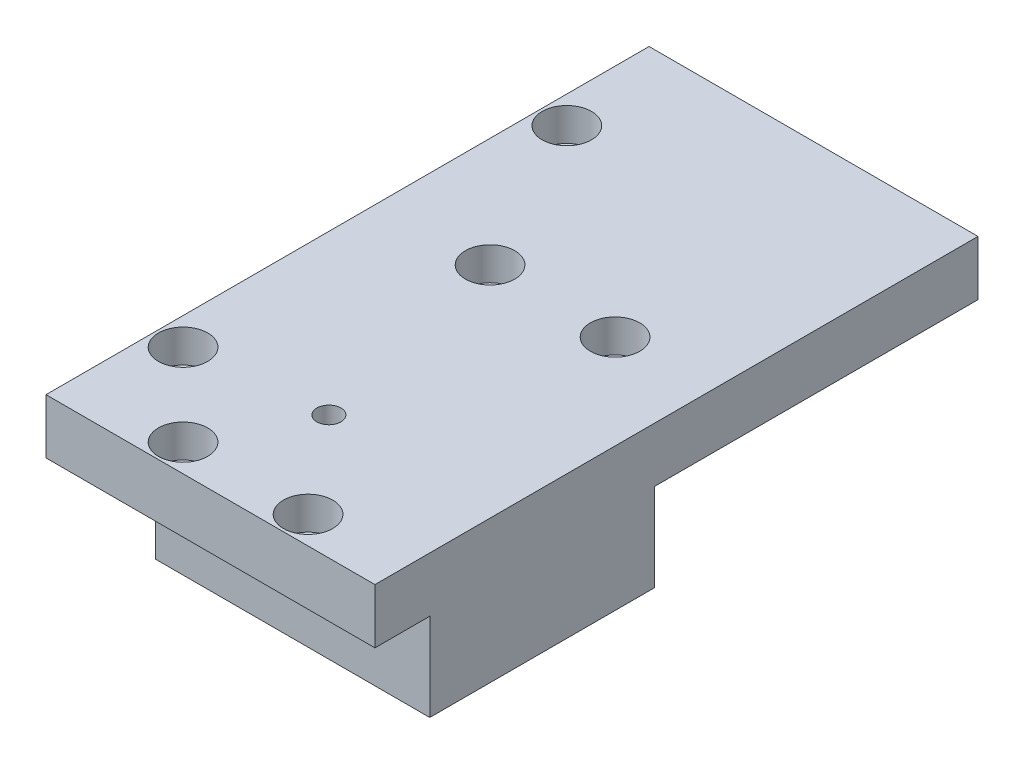
ISO-10303-21;
HEADER;
FILE_DESCRIPTION(('STEP AP214'),'2;1');
FILE_NAME('part.step','',(''),(''),'','','');
FILE_SCHEMA(('AUTOMOTIVE_DESIGN { 1 0 10303 214 1 1 1 1 }'));
ENDSEC;
DATA;
#1=APPLICATION_CONTEXT('core data for automotive mechanical design processes');
#2=APPLICATION_PROTOCOL_DEFINITION('international standard','automotive_design',2000,#1);
#3=PRODUCT_CONTEXT('',#1,'mechanical');
#4=PRODUCT('Part','Part','',(#3));
#5=PRODUCT_RELATED_PRODUCT_CATEGORY('part','',(#4));
#6=PRODUCT_DEFINITION_FORMATION('','',#4);
#7=PRODUCT_DEFINITION_CONTEXT('part definition',#1,'design');
#8=PRODUCT_DEFINITION('design','',#6,#7);
#9=PRODUCT_DEFINITION_SHAPE('','',#8);
#10=(LENGTH_UNIT() NAMED_UNIT(*) SI_UNIT(.MILLI.,.METRE.));
#11=(NAMED_UNIT(*) PLANE_ANGLE_UNIT() SI_UNIT($,.RADIAN.));
#12=(NAMED_UNIT(*) SI_UNIT($,.STERADIAN.) SOLID_ANGLE_UNIT());
#13=UNCERTAINTY_MEASURE_WITH_UNIT(LENGTH_MEASURE(1.E-05),#10,'distance_accuracy_value','');
#14=(GEOMETRIC_REPRESENTATION_CONTEXT(3) GLOBAL_UNCERTAINTY_ASSIGNED_CONTEXT((#13)) GLOBAL_UNIT_ASSIGNED_CONTEXT((#10,
#11,#12)) REPRESENTATION_CONTEXT('',''));
#15=CARTESIAN_POINT('',(0.,0.,0.));
#16=DIRECTION('',(0.,0.,1.));
#17=DIRECTION('',(1.,0.,0.));
#18=AXIS2_PLACEMENT_3D('',#15,#16,#17);
#19=CARTESIAN_POINT('',(0.,0.,0.));
#20=DIRECTION('',(0.,1.,0.));
#21=DIRECTION('',(0.,0.,1.));
#22=AXIS2_PLACEMENT_3D('',#19,#20,#21);
#23=PLANE('',#22);
#24=CARTESIAN_POINT('',(-20.,0.,24.5));
#25=DIRECTION('',(0.,1.,0.));
#26=DIRECTION('',(0.,0.,1.));
#27=AXIS2_PLACEMENT_3D('',#24,#25,#26);
#28=CIRCLE('',#27,1.5);
#29=CARTESIAN_POINT('',(-20.,0.,26.));
#30=VERTEX_POINT('',#29);
#31=EDGE_CURVE('E176',#30,#30,#28,.T.);
#32=ORIENTED_EDGE('',*,*,#31,.T.);
#33=EDGE_LOOP('',(#32));
#34=FACE_BOUND('',#33,.T.);
#35=CARTESIAN_POINT('',(-8.60000000000001,0.,52.5));
#36=DIRECTION('',(0.,1.,0.));
#37=DIRECTION('',(0.,0.,1.));
#38=AXIS2_PLACEMENT_3D('',#35,#36,#37);
#39=CIRCLE('',#38,1.5);
#40=CARTESIAN_POINT('',(-8.60000000000001,0.,54.));
#41=VERTEX_POINT('',#40);
#42=EDGE_CURVE('E177',#41,#41,#39,.T.);
#43=ORIENTED_EDGE('',*,*,#42,.T.);
#44=EDGE_LOOP('',(#43));
#45=FACE_BOUND('',#44,.T.);
#46=CARTESIAN_POINT('',(-20.,0.,52.5));
#47=DIRECTION('',(0.,1.,0.));
#48=DIRECTION('',(0.,0.,1.));
#49=AXIS2_PLACEMENT_3D('',#46,#47,#48);
#50=CIRCLE('',#49,1.5);
#51=CARTESIAN_POINT('',(-20.,0.,54.));
#52=VERTEX_POINT('',#51);
#53=EDGE_CURVE('E180',#52,#52,#50,.T.);
#54=ORIENTED_EDGE('',*,*,#53,.T.);
#55=EDGE_LOOP('',(#54));
#56=FACE_BOUND('',#55,.T.);
#57=CARTESIAN_POINT('',(-27.5,0.,45.));
#58=DIRECTION('',(0.,1.,0.));
#59=DIRECTION('',(0.,0.,1.));
#60=AXIS2_PLACEMENT_3D('',#57,#58,#59);
#61=CIRCLE('',#60,1.5);
#62=CARTESIAN_POINT('',(-27.5,0.,46.5));
#63=VERTEX_POINT('',#62);
#64=EDGE_CURVE('E172',#63,#63,#61,.T.);
#65=ORIENTED_EDGE('',*,*,#64,.T.);
#66=EDGE_LOOP('',(#65));
#67=FACE_BOUND('',#66,.T.);
#68=CARTESIAN_POINT('',(-8.60000000000001,0.,24.5));
#69=DIRECTION('',(0.,1.,0.));
#70=DIRECTION('',(0.,0.,1.));
#71=AXIS2_PLACEMENT_3D('',#68,#69,#70);
#72=CIRCLE('',#71,1.5);
#73=CARTESIAN_POINT('',(-8.60000000000001,0.,26.));
#74=VERTEX_POINT('',#73);
#75=EDGE_CURVE('E173',#74,#74,#72,.T.);
#76=ORIENTED_EDGE('',*,*,#75,.T.);
#77=EDGE_LOOP('',(#76));
#78=FACE_BOUND('',#77,.T.);
#79=CARTESIAN_POINT('',(-27.5,0.,9.99999999999999));
#80=DIRECTION('',(0.,1.,0.));
#81=DIRECTION('',(0.,0.,1.));
#82=AXIS2_PLACEMENT_3D('',#79,#80,#81);
#83=CIRCLE('',#82,1.5);
#84=CARTESIAN_POINT('',(-27.5,0.,11.5));
#85=VERTEX_POINT('',#84);
#86=EDGE_CURVE('E168',#85,#85,#83,.T.);
#87=ORIENTED_EDGE('',*,*,#86,.T.);
#88=EDGE_LOOP('',(#87));
#89=FACE_BOUND('',#88,.T.);
#90=DIRECTION('',(1.,0.,0.));
#91=VECTOR('',#90,1.);
#92=CARTESIAN_POINT('',(0.,0.,29.5));
#93=LINE('',#92,#91);
#94=CARTESIAN_POINT('',(-25.,0.,29.5));
#95=VERTEX_POINT('',#94);
#96=CARTESIAN_POINT('',(0.,0.,29.5));
#97=VERTEX_POINT('',#96);
#98=EDGE_CURVE('E54',#95,#97,#93,.T.);
#99=ORIENTED_EDGE('',*,*,#98,.F.);
#100=DIRECTION('',(0.,0.,-1.));
#101=VECTOR('',#100,1.);
#102=CARTESIAN_POINT('',(-25.,0.,50.));
#103=LINE('',#102,#101);
#104=CARTESIAN_POINT('',(-25.,0.,50.));
#105=VERTEX_POINT('',#104);
#106=EDGE_CURVE('E294',#105,#95,#103,.T.);
#107=ORIENTED_EDGE('',*,*,#106,.F.);
#108=DIRECTION('',(-1.,0.,0.));
#109=VECTOR('',#108,1.);
#110=CARTESIAN_POINT('',(0.,0.,50.));
#111=LINE('',#110,#109);
#112=CARTESIAN_POINT('',(0.,0.,50.));
#113=VERTEX_POINT('',#112);
#114=EDGE_CURVE('E296',#113,#105,#111,.T.);
#115=ORIENTED_EDGE('',*,*,#114,.F.);
#116=DIRECTION('',(0.,0.,-1.));
#117=VECTOR('',#116,1.);
#118=CARTESIAN_POINT('',(0.,0.,55.));
#119=LINE('',#118,#117);
#120=CARTESIAN_POINT('',(0.,0.,55.));
#121=VERTEX_POINT('',#120);
#122=EDGE_CURVE('E125',#121,#113,#119,.T.);
#123=ORIENTED_EDGE('',*,*,#122,.F.);
#124=DIRECTION('',(1.,0.,0.));
#125=VECTOR('',#124,1.);
#126=CARTESIAN_POINT('',(-30.,0.,55.));
#127=LINE('',#126,#125);
#128=CARTESIAN_POINT('',(-30.,0.,55.));
#129=VERTEX_POINT('',#128);
#130=EDGE_CURVE('E171',#129,#121,#127,.T.);
#131=ORIENTED_EDGE('',*,*,#130,.F.);
#132=DIRECTION('',(0.,0.,-1.));
#133=VECTOR('',#132,1.);
#134=CARTESIAN_POINT('',(-30.,0.,55.));
#135=LINE('',#134,#133);
#136=CARTESIAN_POINT('',(-30.,0.,0.));
#137=VERTEX_POINT('',#136);
#138=EDGE_CURVE('E191',#129,#137,#135,.T.);
#139=ORIENTED_EDGE('',*,*,#138,.T.);
#140=DIRECTION('',(1.,0.,0.));
#141=VECTOR('',#140,1.);
#142=CARTESIAN_POINT('',(-30.,0.,0.));
#143=LINE('',#142,#141);
#144=CARTESIAN_POINT('',(0.,0.,0.));
#145=VERTEX_POINT('',#144);
#146=EDGE_CURVE('E203',#137,#145,#143,.T.);
#147=ORIENTED_EDGE('',*,*,#146,.T.);
#148=EDGE_CURVE('E59',#97,#145,#119,.T.);
#149=ORIENTED_EDGE('',*,*,#148,.F.);
#150=EDGE_LOOP('',(#99,#107,#115,#123,#131,#139,#147,#149));
#151=FACE_BOUND('',#150,.T.);
#152=ADVANCED_FACE('F37',(#34,#45,#56,#67,#78,#89,#151),#23,.F.);
#153=CARTESIAN_POINT('',(-20.,0.,24.5));
#154=DIRECTION('',(0.,1.,0.));
#155=DIRECTION('',(0.,0.,1.));
#156=AXIS2_PLACEMENT_3D('',#153,#154,#155);
#157=CYLINDRICAL_SURFACE('',#156,1.5);
#158=ORIENTED_EDGE('',*,*,#31,.F.);
#159=EDGE_LOOP('',(#158));
#160=FACE_BOUND('',#159,.T.);
#161=CARTESIAN_POINT('',(-20.,2.,24.5));
#162=DIRECTION('',(0.,1.,0.));
#163=DIRECTION('',(0.,0.,1.));
#164=AXIS2_PLACEMENT_3D('',#161,#162,#163);
#165=CIRCLE('',#164,1.5);
#166=CARTESIAN_POINT('',(-20.,2.,26.));
#167=VERTEX_POINT('',#166);
#168=EDGE_CURVE('E41',#167,#167,#165,.F.);
#169=ORIENTED_EDGE('',*,*,#168,.F.);
#170=EDGE_LOOP('',(#169));
#171=FACE_BOUND('',#170,.T.);
#172=ADVANCED_FACE('F231',(#160,#171),#157,.F.);
#173=CARTESIAN_POINT('',(-8.60000000000001,0.,52.5));
#174=DIRECTION('',(0.,1.,0.));
#175=DIRECTION('',(0.,0.,1.));
#176=AXIS2_PLACEMENT_3D('',#173,#174,#175);
#177=CYLINDRICAL_SURFACE('',#176,1.5);
#178=ORIENTED_EDGE('',*,*,#42,.F.);
#179=EDGE_LOOP('',(#178));
#180=FACE_BOUND('',#179,.T.);
#181=CARTESIAN_POINT('',(-8.60000000000001,2.,52.5));
#182=DIRECTION('',(0.,1.,0.));
#183=DIRECTION('',(0.,0.,1.));
#184=AXIS2_PLACEMENT_3D('',#181,#182,#183);
#185=CIRCLE('',#184,1.5);
#186=CARTESIAN_POINT('',(-8.60000000000001,2.,54.));
#187=VERTEX_POINT('',#186);
#188=EDGE_CURVE('E222',#187,#187,#185,.F.);
#189=ORIENTED_EDGE('',*,*,#188,.F.);
#190=EDGE_LOOP('',(#189));
#191=FACE_BOUND('',#190,.T.);
#192=ADVANCED_FACE('F233',(#180,#191),#177,.F.);
#193=CARTESIAN_POINT('',(-20.,0.,52.5));
#194=DIRECTION('',(0.,1.,0.));
#195=DIRECTION('',(0.,0.,1.));
#196=AXIS2_PLACEMENT_3D('',#193,#194,#195);
#197=CYLINDRICAL_SURFACE('',#196,1.5);
#198=ORIENTED_EDGE('',*,*,#53,.F.);
#199=EDGE_LOOP('',(#198));
#200=FACE_BOUND('',#199,.T.);
#201=CARTESIAN_POINT('',(-20.,2.,52.5));
#202=DIRECTION('',(0.,1.,0.));
#203=DIRECTION('',(0.,0.,1.));
#204=AXIS2_PLACEMENT_3D('',#201,#202,#203);
#205=CIRCLE('',#204,1.5);
#206=CARTESIAN_POINT('',(-20.,2.,54.));
#207=VERTEX_POINT('',#206);
#208=EDGE_CURVE('E220',#207,#207,#205,.F.);
#209=ORIENTED_EDGE('',*,*,#208,.F.);
#210=EDGE_LOOP('',(#209));
#211=FACE_BOUND('',#210,.T.);
#212=ADVANCED_FACE('F240',(#200,#211),#197,.F.);
#213=CARTESIAN_POINT('',(-27.5,0.,45.));
#214=DIRECTION('',(0.,1.,0.));
#215=DIRECTION('',(0.,0.,1.));
#216=AXIS2_PLACEMENT_3D('',#213,#214,#215);
#217=CYLINDRICAL_SURFACE('',#216,1.5);
#218=ORIENTED_EDGE('',*,*,#64,.F.);
#219=EDGE_LOOP('',(#218));
#220=FACE_BOUND('',#219,.T.);
#221=CARTESIAN_POINT('',(-27.5,2.,45.));
#222=DIRECTION('',(0.,1.,0.));
#223=DIRECTION('',(0.,0.,1.));
#224=AXIS2_PLACEMENT_3D('',#221,#222,#223);
#225=CIRCLE('',#224,1.5);
#226=CARTESIAN_POINT('',(-27.5,2.,46.5));
#227=VERTEX_POINT('',#226);
#228=EDGE_CURVE('E217',#227,#227,#225,.F.);
#229=ORIENTED_EDGE('',*,*,#228,.F.);
#230=EDGE_LOOP('',(#229));
#231=FACE_BOUND('',#230,.T.);
#232=ADVANCED_FACE('F248',(#220,#231),#217,.F.);
#233=CARTESIAN_POINT('',(-8.60000000000001,0.,24.5));
#234=DIRECTION('',(0.,1.,0.));
#235=DIRECTION('',(0.,0.,1.));
#236=AXIS2_PLACEMENT_3D('',#233,#234,#235);
#237=CYLINDRICAL_SURFACE('',#236,1.5);
#238=ORIENTED_EDGE('',*,*,#75,.F.);
#239=EDGE_LOOP('',(#238));
#240=FACE_BOUND('',#239,.T.);
#241=CARTESIAN_POINT('',(-8.60000000000001,2.,24.5));
#242=DIRECTION('',(0.,1.,0.));
#243=DIRECTION('',(0.,0.,1.));
#244=AXIS2_PLACEMENT_3D('',#241,#242,#243);
#245=CIRCLE('',#244,1.5);
#246=CARTESIAN_POINT('',(-8.60000000000001,2.,26.));
#247=VERTEX_POINT('',#246);
#248=EDGE_CURVE('E214',#247,#247,#245,.F.);
#249=ORIENTED_EDGE('',*,*,#248,.F.);
#250=EDGE_LOOP('',(#249));
#251=FACE_BOUND('',#250,.T.);
#252=ADVANCED_FACE('F251',(#240,#251),#237,.F.);
#253=CARTESIAN_POINT('',(-27.5,0.,9.99999999999999));
#254=DIRECTION('',(0.,1.,0.));
#255=DIRECTION('',(0.,0.,1.));
#256=AXIS2_PLACEMENT_3D('',#253,#254,#255);
#257=CYLINDRICAL_SURFACE('',#256,1.5);
#258=ORIENTED_EDGE('',*,*,#86,.F.);
#259=EDGE_LOOP('',(#258));
#260=FACE_BOUND('',#259,.T.);
#261=CARTESIAN_POINT('',(-27.5,2.,9.99999999999999));
#262=DIRECTION('',(0.,1.,0.));
#263=DIRECTION('',(0.,0.,1.));
#264=AXIS2_PLACEMENT_3D('',#261,#262,#263);
#265=CIRCLE('',#264,1.5);
#266=CARTESIAN_POINT('',(-27.5,2.,11.5));
#267=VERTEX_POINT('',#266);
#268=EDGE_CURVE('E141',#267,#267,#265,.F.);
#269=ORIENTED_EDGE('',*,*,#268,.F.);
#270=EDGE_LOOP('',(#269));
#271=FACE_BOUND('',#270,.T.);
#272=ADVANCED_FACE('F272',(#260,#271),#257,.F.);
#273=CARTESIAN_POINT('',(-30.,5.,55.));
#274=DIRECTION('',(0.,0.,-1.));
#275=DIRECTION('',(-1.,0.,0.));
#276=AXIS2_PLACEMENT_3D('',#273,#274,#275);
#277=PLANE('',#276);
#278=ORIENTED_EDGE('',*,*,#130,.T.);
#279=DIRECTION('',(0.,-1.,0.));
#280=VECTOR('',#279,1.);
#281=CARTESIAN_POINT('',(0.,5.,55.));
#282=LINE('',#281,#280);
#283=CARTESIAN_POINT('',(0.,5.,55.));
#284=VERTEX_POINT('',#283);
#285=EDGE_CURVE('E12',#284,#121,#282,.T.);
#286=ORIENTED_EDGE('',*,*,#285,.F.);
#287=DIRECTION('',(1.,0.,0.));
#288=VECTOR('',#287,1.);
#289=CARTESIAN_POINT('',(-30.,5.,55.));
#290=LINE('',#289,#288);
#291=CARTESIAN_POINT('',(-30.,5.,55.));
#292=VERTEX_POINT('',#291);
#293=EDGE_CURVE('E187',#292,#284,#290,.T.);
#294=ORIENTED_EDGE('',*,*,#293,.F.);
#295=DIRECTION('',(0.,-1.,0.));
#296=VECTOR('',#295,1.);
#297=CARTESIAN_POINT('',(-30.,5.,55.));
#298=LINE('',#297,#296);
#299=EDGE_CURVE('E199',#292,#129,#298,.T.);
#300=ORIENTED_EDGE('',*,*,#299,.T.);
#301=EDGE_LOOP('',(#278,#286,#294,#300));
#302=FACE_BOUND('',#301,.T.);
#303=ADVANCED_FACE('F39',(#302),#277,.F.);
#304=CARTESIAN_POINT('',(0.,5.,55.));
#305=DIRECTION('',(-1.,0.,0.));
#306=DIRECTION('',(0.,0.,1.));
#307=AXIS2_PLACEMENT_3D('',#304,#305,#306);
#308=PLANE('',#307);
#309=ORIENTED_EDGE('',*,*,#122,.T.);
#310=DIRECTION('',(0.,1.,0.));
#311=VECTOR('',#310,1.);
#312=CARTESIAN_POINT('',(0.,-8.,50.));
#313=LINE('',#312,#311);
#314=CARTESIAN_POINT('',(0.,-8.,50.));
#315=VERTEX_POINT('',#314);
#316=EDGE_CURVE('E107',#315,#113,#313,.T.);
#317=ORIENTED_EDGE('',*,*,#316,.F.);
#318=DIRECTION('',(0.,0.,1.));
#319=VECTOR('',#318,1.);
#320=CARTESIAN_POINT('',(0.,-8.,50.));
#321=LINE('',#320,#319);
#322=CARTESIAN_POINT('',(0.,-8.,29.5));
#323=VERTEX_POINT('',#322);
#324=EDGE_CURVE('E113',#323,#315,#321,.T.);
#325=ORIENTED_EDGE('',*,*,#324,.F.);
#326=DIRECTION('',(0.,1.,0.));
#327=VECTOR('',#326,1.);
#328=CARTESIAN_POINT('',(0.,-8.,29.5));
#329=LINE('',#328,#327);
#330=EDGE_CURVE('E287',#323,#97,#329,.T.);
#331=ORIENTED_EDGE('',*,*,#330,.T.);
#332=ORIENTED_EDGE('',*,*,#148,.T.);
#333=DIRECTION('',(0.,-1.,0.));
#334=VECTOR('',#333,1.);
#335=CARTESIAN_POINT('',(0.,5.,0.));
#336=LINE('',#335,#334);
#337=CARTESIAN_POINT('',(0.,5.,0.));
#338=VERTEX_POINT('',#337);
#339=EDGE_CURVE('E46',#338,#145,#336,.T.);
#340=ORIENTED_EDGE('',*,*,#339,.F.);
#341=DIRECTION('',(0.,0.,-1.));
#342=VECTOR('',#341,1.);
#343=CARTESIAN_POINT('',(0.,5.,55.));
#344=LINE('',#343,#342);
#345=EDGE_CURVE('E190',#284,#338,#344,.T.);
#346=ORIENTED_EDGE('',*,*,#345,.F.);
#347=ORIENTED_EDGE('',*,*,#285,.T.);
#348=EDGE_LOOP('',(#309,#317,#325,#331,#332,#340,#346,#347));
#349=FACE_BOUND('',#348,.T.);
#350=ADVANCED_FACE('F124',(#349),#308,.F.);
#351=CARTESIAN_POINT('',(-30.,5.,0.));
#352=DIRECTION('',(0.,0.,-1.));
#353=DIRECTION('',(-1.,0.,0.));
#354=AXIS2_PLACEMENT_3D('',#351,#352,#353);
#355=PLANE('',#354);
#356=ORIENTED_EDGE('',*,*,#146,.F.);
#357=DIRECTION('',(0.,-1.,0.));
#358=VECTOR('',#357,1.);
#359=CARTESIAN_POINT('',(-30.,5.,0.));
#360=LINE('',#359,#358);
#361=CARTESIAN_POINT('',(-30.,5.,0.));
#362=VERTEX_POINT('',#361);
#363=EDGE_CURVE('E208',#362,#137,#360,.T.);
#364=ORIENTED_EDGE('',*,*,#363,.F.);
#365=DIRECTION('',(1.,0.,0.));
#366=VECTOR('',#365,1.);
#367=CARTESIAN_POINT('',(-30.,5.,0.));
#368=LINE('',#367,#366);
#369=EDGE_CURVE('E193',#362,#338,#368,.T.);
#370=ORIENTED_EDGE('',*,*,#369,.T.);
#371=ORIENTED_EDGE('',*,*,#339,.T.);
#372=EDGE_LOOP('',(#356,#364,#370,#371));
#373=FACE_BOUND('',#372,.T.);
#374=ADVANCED_FACE('F264',(#373),#355,.T.);
#375=CARTESIAN_POINT('',(-30.,5.,55.));
#376=DIRECTION('',(-1.,0.,0.));
#377=DIRECTION('',(0.,0.,1.));
#378=AXIS2_PLACEMENT_3D('',#375,#376,#377);
#379=PLANE('',#378);
#380=ORIENTED_EDGE('',*,*,#138,.F.);
#381=ORIENTED_EDGE('',*,*,#299,.F.);
#382=DIRECTION('',(0.,0.,-1.));
#383=VECTOR('',#382,1.);
#384=CARTESIAN_POINT('',(-30.,5.,55.));
#385=LINE('',#384,#383);
#386=EDGE_CURVE('E196',#292,#362,#385,.T.);
#387=ORIENTED_EDGE('',*,*,#386,.T.);
#388=ORIENTED_EDGE('',*,*,#363,.T.);
#389=EDGE_LOOP('',(#380,#381,#387,#388));
#390=FACE_BOUND('',#389,.T.);
#391=ADVANCED_FACE('F259',(#390),#379,.T.);
#392=CARTESIAN_POINT('',(0.,5.,0.));
#393=DIRECTION('',(0.,1.,0.));
#394=DIRECTION('',(0.,0.,1.));
#395=AXIS2_PLACEMENT_3D('',#392,#393,#394);
#396=PLANE('',#395);
#397=CARTESIAN_POINT('',(-15.4999999999995,5.,43.701964886511));
#398=DIRECTION('',(0.,-1.,0.));
#399=DIRECTION('',(0.,0.,-1.));
#400=AXIS2_PLACEMENT_3D('',#397,#398,#399);
#401=CIRCLE('',#400,1.1);
#402=CARTESIAN_POINT('',(-15.4999999999995,5.,42.601964886511));
#403=VERTEX_POINT('',#402);
#404=EDGE_CURVE('E303',#403,#403,#401,.T.);
#405=ORIENTED_EDGE('',*,*,#404,.T.);
#406=EDGE_LOOP('',(#405));
#407=FACE_BOUND('',#406,.T.);
#408=CARTESIAN_POINT('',(-27.5,5.,9.99999999999999));
#409=DIRECTION('',(0.,1.,0.));
#410=DIRECTION('',(0.,0.,1.));
#411=AXIS2_PLACEMENT_3D('',#408,#409,#410);
#412=CIRCLE('',#411,2.25);
#413=CARTESIAN_POINT('',(-27.5,5.,12.25));
#414=VERTEX_POINT('',#413);
#415=EDGE_CURVE('E135',#414,#414,#412,.T.);
#416=ORIENTED_EDGE('',*,*,#415,.F.);
#417=EDGE_LOOP('',(#416));
#418=FACE_BOUND('',#417,.T.);
#419=CARTESIAN_POINT('',(-8.60000000000001,5.,24.5));
#420=DIRECTION('',(0.,1.,0.));
#421=DIRECTION('',(0.,0.,1.));
#422=AXIS2_PLACEMENT_3D('',#419,#420,#421);
#423=CIRCLE('',#422,2.25);
#424=CARTESIAN_POINT('',(-8.60000000000001,5.,26.75));
#425=VERTEX_POINT('',#424);
#426=EDGE_CURVE('E129',#425,#425,#423,.T.);
#427=ORIENTED_EDGE('',*,*,#426,.F.);
#428=EDGE_LOOP('',(#427));
#429=FACE_BOUND('',#428,.T.);
#430=CARTESIAN_POINT('',(-27.5,5.,45.));
#431=DIRECTION('',(0.,1.,0.));
#432=DIRECTION('',(0.,0.,1.));
#433=AXIS2_PLACEMENT_3D('',#430,#431,#432);
#434=CIRCLE('',#433,2.25);
#435=CARTESIAN_POINT('',(-27.5,5.,47.25));
#436=VERTEX_POINT('',#435);
#437=EDGE_CURVE('E139',#436,#436,#434,.T.);
#438=ORIENTED_EDGE('',*,*,#437,.F.);
#439=EDGE_LOOP('',(#438));
#440=FACE_BOUND('',#439,.T.);
#441=CARTESIAN_POINT('',(-20.,5.,52.5));
#442=DIRECTION('',(0.,1.,0.));
#443=DIRECTION('',(0.,0.,1.));
#444=AXIS2_PLACEMENT_3D('',#441,#442,#443);
#445=CIRCLE('',#444,2.25);
#446=CARTESIAN_POINT('',(-20.,5.,54.75));
#447=VERTEX_POINT('',#446);
#448=EDGE_CURVE('E161',#447,#447,#445,.T.);
#449=ORIENTED_EDGE('',*,*,#448,.F.);
#450=EDGE_LOOP('',(#449));
#451=FACE_BOUND('',#450,.T.);
#452=CARTESIAN_POINT('',(-8.60000000000001,5.,52.5));
#453=DIRECTION('',(0.,1.,0.));
#454=DIRECTION('',(0.,0.,1.));
#455=AXIS2_PLACEMENT_3D('',#452,#453,#454);
#456=CIRCLE('',#455,2.25);
#457=CARTESIAN_POINT('',(-8.60000000000001,5.,54.75));
#458=VERTEX_POINT('',#457);
#459=EDGE_CURVE('E149',#458,#458,#456,.T.);
#460=ORIENTED_EDGE('',*,*,#459,.F.);
#461=EDGE_LOOP('',(#460));
#462=FACE_BOUND('',#461,.T.);
#463=CARTESIAN_POINT('',(-20.,5.,24.5));
#464=DIRECTION('',(0.,1.,0.));
#465=DIRECTION('',(0.,0.,1.));
#466=AXIS2_PLACEMENT_3D('',#463,#464,#465);
#467=CIRCLE('',#466,2.25);
#468=CARTESIAN_POINT('',(-20.,5.,26.75));
#469=VERTEX_POINT('',#468);
#470=EDGE_CURVE('E150',#469,#469,#467,.T.);
#471=ORIENTED_EDGE('',*,*,#470,.F.);
#472=EDGE_LOOP('',(#471));
#473=FACE_BOUND('',#472,.T.);
#474=ORIENTED_EDGE('',*,*,#293,.T.);
#475=ORIENTED_EDGE('',*,*,#345,.T.);
#476=ORIENTED_EDGE('',*,*,#369,.F.);
#477=ORIENTED_EDGE('',*,*,#386,.F.);
#478=EDGE_LOOP('',(#474,#475,#476,#477));
#479=FACE_BOUND('',#478,.T.);
#480=ADVANCED_FACE('F256',(#407,#418,#429,#440,#451,#462,#473,#479),#396,.T.);
#481=CARTESIAN_POINT('',(0.,2.,0.));
#482=DIRECTION('',(0.,1.,0.));
#483=DIRECTION('',(0.,0.,1.));
#484=AXIS2_PLACEMENT_3D('',#481,#482,#483);
#485=PLANE('',#484);
#486=CARTESIAN_POINT('',(-27.5,2.,9.99999999999999));
#487=DIRECTION('',(0.,1.,0.));
#488=DIRECTION('',(0.,0.,1.));
#489=AXIS2_PLACEMENT_3D('',#486,#487,#488);
#490=CIRCLE('',#489,2.25);
#491=CARTESIAN_POINT('',(-27.5,2.,12.25));
#492=VERTEX_POINT('',#491);
#493=EDGE_CURVE('E138',#492,#492,#490,.F.);
#494=ORIENTED_EDGE('',*,*,#493,.F.);
#495=EDGE_LOOP('',(#494));
#496=FACE_BOUND('',#495,.T.);
#497=ORIENTED_EDGE('',*,*,#268,.T.);
#498=EDGE_LOOP('',(#497));
#499=FACE_BOUND('',#498,.T.);
#500=ADVANCED_FACE('F258',(#496,#499),#485,.T.);
#501=CARTESIAN_POINT('',(-27.5,-6.36396103067893,9.99999999999999));
#502=DIRECTION('',(0.,1.,0.));
#503=DIRECTION('',(0.,0.,1.));
#504=AXIS2_PLACEMENT_3D('',#501,#502,#503);
#505=CYLINDRICAL_SURFACE('',#504,2.25);
#506=ORIENTED_EDGE('',*,*,#493,.T.);
#507=EDGE_LOOP('',(#506));
#508=FACE_BOUND('',#507,.T.);
#509=ORIENTED_EDGE('',*,*,#415,.T.);
#510=EDGE_LOOP('',(#509));
#511=FACE_BOUND('',#510,.T.);
#512=ADVANCED_FACE('F348',(#508,#511),#505,.F.);
#513=CARTESIAN_POINT('',(0.,2.,0.));
#514=DIRECTION('',(0.,1.,0.));
#515=DIRECTION('',(0.,0.,1.));
#516=AXIS2_PLACEMENT_3D('',#513,#514,#515);
#517=PLANE('',#516);
#518=CARTESIAN_POINT('',(-8.60000000000001,2.,24.5));
#519=DIRECTION('',(0.,1.,0.));
#520=DIRECTION('',(0.,0.,1.));
#521=AXIS2_PLACEMENT_3D('',#518,#519,#520);
#522=CIRCLE('',#521,2.25);
#523=CARTESIAN_POINT('',(-8.60000000000001,2.,26.75));
#524=VERTEX_POINT('',#523);
#525=EDGE_CURVE('E126',#524,#524,#522,.F.);
#526=ORIENTED_EDGE('',*,*,#525,.F.);
#527=EDGE_LOOP('',(#526));
#528=FACE_BOUND('',#527,.T.);
#529=ORIENTED_EDGE('',*,*,#248,.T.);
#530=EDGE_LOOP('',(#529));
#531=FACE_BOUND('',#530,.T.);
#532=ADVANCED_FACE('F352',(#528,#531),#517,.T.);
#533=CARTESIAN_POINT('',(-8.60000000000001,-6.36396103067893,24.5));
#534=DIRECTION('',(0.,1.,0.));
#535=DIRECTION('',(0.,0.,1.));
#536=AXIS2_PLACEMENT_3D('',#533,#534,#535);
#537=CYLINDRICAL_SURFACE('',#536,2.25);
#538=ORIENTED_EDGE('',*,*,#525,.T.);
#539=EDGE_LOOP('',(#538));
#540=FACE_BOUND('',#539,.T.);
#541=ORIENTED_EDGE('',*,*,#426,.T.);
#542=EDGE_LOOP('',(#541));
#543=FACE_BOUND('',#542,.T.);
#544=ADVANCED_FACE('F354',(#540,#543),#537,.F.);
#545=CARTESIAN_POINT('',(0.,2.,0.));
#546=DIRECTION('',(0.,1.,0.));
#547=DIRECTION('',(0.,0.,1.));
#548=AXIS2_PLACEMENT_3D('',#545,#546,#547);
#549=PLANE('',#548);
#550=CARTESIAN_POINT('',(-27.5,2.,45.));
#551=DIRECTION('',(0.,1.,0.));
#552=DIRECTION('',(0.,0.,1.));
#553=AXIS2_PLACEMENT_3D('',#550,#551,#552);
#554=CIRCLE('',#553,2.25);
#555=CARTESIAN_POINT('',(-27.5,2.,47.25));
#556=VERTEX_POINT('',#555);
#557=EDGE_CURVE('E158',#556,#556,#554,.F.);
#558=ORIENTED_EDGE('',*,*,#557,.F.);
#559=EDGE_LOOP('',(#558));
#560=FACE_BOUND('',#559,.T.);
#561=ORIENTED_EDGE('',*,*,#228,.T.);
#562=EDGE_LOOP('',(#561));
#563=FACE_BOUND('',#562,.T.);
#564=ADVANCED_FACE('F357',(#560,#563),#549,.T.);
#565=CARTESIAN_POINT('',(-27.5,-6.36396103067893,45.));
#566=DIRECTION('',(0.,1.,0.));
#567=DIRECTION('',(0.,0.,1.));
#568=AXIS2_PLACEMENT_3D('',#565,#566,#567);
#569=CYLINDRICAL_SURFACE('',#568,2.25);
#570=ORIENTED_EDGE('',*,*,#557,.T.);
#571=EDGE_LOOP('',(#570));
#572=FACE_BOUND('',#571,.T.);
#573=ORIENTED_EDGE('',*,*,#437,.T.);
#574=EDGE_LOOP('',(#573));
#575=FACE_BOUND('',#574,.T.);
#576=ADVANCED_FACE('F377',(#572,#575),#569,.F.);
#577=CARTESIAN_POINT('',(0.,2.,0.));
#578=DIRECTION('',(0.,1.,0.));
#579=DIRECTION('',(0.,0.,1.));
#580=AXIS2_PLACEMENT_3D('',#577,#578,#579);
#581=PLANE('',#580);
#582=CARTESIAN_POINT('',(-20.,2.,52.5));
#583=DIRECTION('',(0.,1.,0.));
#584=DIRECTION('',(0.,0.,1.));
#585=AXIS2_PLACEMENT_3D('',#582,#583,#584);
#586=CIRCLE('',#585,2.25);
#587=CARTESIAN_POINT('',(-20.,2.,54.75));
#588=VERTEX_POINT('',#587);
#589=EDGE_CURVE('E153',#588,#588,#586,.F.);
#590=ORIENTED_EDGE('',*,*,#589,.F.);
#591=EDGE_LOOP('',(#590));
#592=FACE_BOUND('',#591,.T.);
#593=ORIENTED_EDGE('',*,*,#208,.T.);
#594=EDGE_LOOP('',(#593));
#595=FACE_BOUND('',#594,.T.);
#596=ADVANCED_FACE('F380',(#592,#595),#581,.T.);
#597=CARTESIAN_POINT('',(-20.,-6.36396103067893,52.5));
#598=DIRECTION('',(0.,1.,0.));
#599=DIRECTION('',(0.,0.,1.));
#600=AXIS2_PLACEMENT_3D('',#597,#598,#599);
#601=CYLINDRICAL_SURFACE('',#600,2.25);
#602=ORIENTED_EDGE('',*,*,#589,.T.);
#603=EDGE_LOOP('',(#602));
#604=FACE_BOUND('',#603,.T.);
#605=ORIENTED_EDGE('',*,*,#448,.T.);
#606=EDGE_LOOP('',(#605));
#607=FACE_BOUND('',#606,.T.);
#608=ADVANCED_FACE('F369',(#604,#607),#601,.F.);
#609=CARTESIAN_POINT('',(0.,2.,0.));
#610=DIRECTION('',(0.,1.,0.));
#611=DIRECTION('',(0.,0.,1.));
#612=AXIS2_PLACEMENT_3D('',#609,#610,#611);
#613=PLANE('',#612);
#614=CARTESIAN_POINT('',(-8.60000000000001,2.,52.5));
#615=DIRECTION('',(0.,1.,0.));
#616=DIRECTION('',(0.,0.,1.));
#617=AXIS2_PLACEMENT_3D('',#614,#615,#616);
#618=CIRCLE('',#617,2.25);
#619=CARTESIAN_POINT('',(-8.60000000000001,2.,54.75));
#620=VERTEX_POINT('',#619);
#621=EDGE_CURVE('E146',#620,#620,#618,.F.);
#622=ORIENTED_EDGE('',*,*,#621,.F.);
#623=EDGE_LOOP('',(#622));
#624=FACE_BOUND('',#623,.T.);
#625=ORIENTED_EDGE('',*,*,#188,.T.);
#626=EDGE_LOOP('',(#625));
#627=FACE_BOUND('',#626,.T.);
#628=ADVANCED_FACE('F365',(#624,#627),#613,.T.);
#629=CARTESIAN_POINT('',(-8.60000000000001,-6.36396103067893,52.5));
#630=DIRECTION('',(0.,1.,0.));
#631=DIRECTION('',(0.,0.,1.));
#632=AXIS2_PLACEMENT_3D('',#629,#630,#631);
#633=CYLINDRICAL_SURFACE('',#632,2.25);
#634=ORIENTED_EDGE('',*,*,#621,.T.);
#635=EDGE_LOOP('',(#634));
#636=FACE_BOUND('',#635,.T.);
#637=ORIENTED_EDGE('',*,*,#459,.T.);
#638=EDGE_LOOP('',(#637));
#639=FACE_BOUND('',#638,.T.);
#640=ADVANCED_FACE('F362',(#636,#639),#633,.F.);
#641=CARTESIAN_POINT('',(0.,2.,0.));
#642=DIRECTION('',(0.,1.,0.));
#643=DIRECTION('',(0.,0.,1.));
#644=AXIS2_PLACEMENT_3D('',#641,#642,#643);
#645=PLANE('',#644);
#646=CARTESIAN_POINT('',(-20.,2.,24.5));
#647=DIRECTION('',(0.,1.,0.));
#648=DIRECTION('',(0.,0.,1.));
#649=AXIS2_PLACEMENT_3D('',#646,#647,#648);
#650=CIRCLE('',#649,2.25);
#651=CARTESIAN_POINT('',(-20.,2.,26.75));
#652=VERTEX_POINT('',#651);
#653=EDGE_CURVE('E145',#652,#652,#650,.F.);
#654=ORIENTED_EDGE('',*,*,#653,.F.);
#655=EDGE_LOOP('',(#654));
#656=FACE_BOUND('',#655,.T.);
#657=ORIENTED_EDGE('',*,*,#168,.T.);
#658=EDGE_LOOP('',(#657));
#659=FACE_BOUND('',#658,.T.);
#660=ADVANCED_FACE('F229',(#656,#659),#645,.T.);
#661=CARTESIAN_POINT('',(-20.,-6.36396103067893,24.5));
#662=DIRECTION('',(0.,1.,0.));
#663=DIRECTION('',(0.,0.,1.));
#664=AXIS2_PLACEMENT_3D('',#661,#662,#663);
#665=CYLINDRICAL_SURFACE('',#664,2.25);
#666=ORIENTED_EDGE('',*,*,#653,.T.);
#667=EDGE_LOOP('',(#666));
#668=FACE_BOUND('',#667,.T.);
#669=ORIENTED_EDGE('',*,*,#470,.T.);
#670=EDGE_LOOP('',(#669));
#671=FACE_BOUND('',#670,.T.);
#672=ADVANCED_FACE('F345',(#668,#671),#665,.F.);
#673=CARTESIAN_POINT('',(0.,-8.,50.));
#674=DIRECTION('',(0.,0.,-1.));
#675=DIRECTION('',(-1.,0.,0.));
#676=AXIS2_PLACEMENT_3D('',#673,#674,#675);
#677=PLANE('',#676);
#678=ORIENTED_EDGE('',*,*,#114,.T.);
#679=DIRECTION('',(0.,1.,0.));
#680=VECTOR('',#679,1.);
#681=CARTESIAN_POINT('',(-25.,-8.,50.));
#682=LINE('',#681,#680);
#683=CARTESIAN_POINT('',(-25.,-8.,50.));
#684=VERTEX_POINT('',#683);
#685=EDGE_CURVE('E109',#684,#105,#682,.T.);
#686=ORIENTED_EDGE('',*,*,#685,.F.);
#687=DIRECTION('',(-1.,0.,0.));
#688=VECTOR('',#687,1.);
#689=CARTESIAN_POINT('',(0.,-8.,50.));
#690=LINE('',#689,#688);
#691=EDGE_CURVE('E102',#315,#684,#690,.T.);
#692=ORIENTED_EDGE('',*,*,#691,.F.);
#693=ORIENTED_EDGE('',*,*,#316,.T.);
#694=EDGE_LOOP('',(#678,#686,#692,#693));
#695=FACE_BOUND('',#694,.T.);
#696=ADVANCED_FACE('F105',(#695),#677,.F.);
#697=CARTESIAN_POINT('',(-25.,-8.,50.));
#698=DIRECTION('',(1.,0.,0.));
#699=DIRECTION('',(0.,0.,-1.));
#700=AXIS2_PLACEMENT_3D('',#697,#698,#699);
#701=PLANE('',#700);
#702=ORIENTED_EDGE('',*,*,#106,.T.);
#703=DIRECTION('',(0.,1.,0.));
#704=VECTOR('',#703,1.);
#705=CARTESIAN_POINT('',(-25.,-8.,29.5));
#706=LINE('',#705,#704);
#707=CARTESIAN_POINT('',(-25.,-8.,29.5));
#708=VERTEX_POINT('',#707);
#709=EDGE_CURVE('E131',#708,#95,#706,.T.);
#710=ORIENTED_EDGE('',*,*,#709,.F.);
#711=DIRECTION('',(0.,0.,-1.));
#712=VECTOR('',#711,1.);
#713=CARTESIAN_POINT('',(-25.,-8.,50.));
#714=LINE('',#713,#712);
#715=EDGE_CURVE('E112',#684,#708,#714,.T.);
#716=ORIENTED_EDGE('',*,*,#715,.F.);
#717=ORIENTED_EDGE('',*,*,#685,.T.);
#718=EDGE_LOOP('',(#702,#710,#716,#717));
#719=FACE_BOUND('',#718,.T.);
#720=ADVANCED_FACE('F339',(#719),#701,.F.);
#721=CARTESIAN_POINT('',(0.,-8.,29.5));
#722=DIRECTION('',(0.,0.,1.));
#723=DIRECTION('',(1.,0.,0.));
#724=AXIS2_PLACEMENT_3D('',#721,#722,#723);
#725=PLANE('',#724);
#726=ORIENTED_EDGE('',*,*,#98,.T.);
#727=ORIENTED_EDGE('',*,*,#330,.F.);
#728=DIRECTION('',(1.,0.,0.));
#729=VECTOR('',#728,1.);
#730=CARTESIAN_POINT('',(0.,-8.,29.5));
#731=LINE('',#730,#729);
#732=EDGE_CURVE('E118',#708,#323,#731,.T.);
#733=ORIENTED_EDGE('',*,*,#732,.F.);
#734=ORIENTED_EDGE('',*,*,#709,.T.);
#735=EDGE_LOOP('',(#726,#727,#733,#734));
#736=FACE_BOUND('',#735,.T.);
#737=ADVANCED_FACE('F323',(#736),#725,.F.);
#738=CARTESIAN_POINT('',(0.,-8.,0.));
#739=DIRECTION('',(0.,1.,0.));
#740=DIRECTION('',(0.,0.,1.));
#741=AXIS2_PLACEMENT_3D('',#738,#739,#740);
#742=PLANE('',#741);
#743=CARTESIAN_POINT('',(-15.4999999999995,-8.,43.701964886511));
#744=DIRECTION('',(0.,-1.,0.));
#745=DIRECTION('',(0.,0.,-1.));
#746=AXIS2_PLACEMENT_3D('',#743,#744,#745);
#747=CIRCLE('',#746,1.1);
#748=CARTESIAN_POINT('',(-15.4999999999995,-8.,42.601964886511));
#749=VERTEX_POINT('',#748);
#750=EDGE_CURVE('E306',#749,#749,#747,.T.);
#751=ORIENTED_EDGE('',*,*,#750,.F.);
#752=EDGE_LOOP('',(#751));
#753=FACE_BOUND('',#752,.T.);
#754=CARTESIAN_POINT('',(-4.59999999999954,-8.,40.0359043305463));
#755=DIRECTION('',(0.,-1.,0.));
#756=DIRECTION('',(0.,0.,-1.));
#757=AXIS2_PLACEMENT_3D('',#754,#755,#756);
#758=CIRCLE('',#757,3.1);
#759=CARTESIAN_POINT('',(-4.59999999999954,-8.,36.9359043305463));
#760=VERTEX_POINT('',#759);
#761=EDGE_CURVE('E300',#760,#760,#758,.T.);
#762=ORIENTED_EDGE('',*,*,#761,.F.);
#763=EDGE_LOOP('',(#762));
#764=FACE_BOUND('',#763,.T.);
#765=ORIENTED_EDGE('',*,*,#324,.T.);
#766=ORIENTED_EDGE('',*,*,#691,.T.);
#767=ORIENTED_EDGE('',*,*,#715,.T.);
#768=ORIENTED_EDGE('',*,*,#732,.T.);
#769=EDGE_LOOP('',(#765,#766,#767,#768));
#770=FACE_BOUND('',#769,.T.);
#771=ADVANCED_FACE('F116',(#753,#764,#770),#742,.F.);
#772=CARTESIAN_POINT('',(-4.59999999999954,-5.4,40.0359043305463));
#773=DIRECTION('',(0.,-1.,0.));
#774=DIRECTION('',(0.,0.,-1.));
#775=AXIS2_PLACEMENT_3D('',#772,#773,#774);
#776=CYLINDRICAL_SURFACE('',#775,3.1);
#777=CARTESIAN_POINT('',(-4.59999999999954,-5.4,40.0359043305463));
#778=DIRECTION('',(0.,-1.,0.));
#779=DIRECTION('',(0.,0.,-1.));
#780=AXIS2_PLACEMENT_3D('',#777,#778,#779);
#781=CIRCLE('',#780,3.1);
#782=CARTESIAN_POINT('',(-4.59999999999954,-5.4,36.9359043305463));
#783=VERTEX_POINT('',#782);
#784=EDGE_CURVE('E297',#783,#783,#781,.T.);
#785=ORIENTED_EDGE('',*,*,#784,.F.);
#786=EDGE_LOOP('',(#785));
#787=FACE_BOUND('',#786,.T.);
#788=ORIENTED_EDGE('',*,*,#761,.T.);
#789=EDGE_LOOP('',(#788));
#790=FACE_BOUND('',#789,.T.);
#791=ADVANCED_FACE('F322',(#787,#790),#776,.F.);
#792=CARTESIAN_POINT('',(-4.59999999999954,-5.4,40.0359043305463));
#793=DIRECTION('',(0.,-1.,0.));
#794=DIRECTION('',(0.,0.,-1.));
#795=AXIS2_PLACEMENT_3D('',#792,#793,#794);
#796=PLANE('',#795);
#797=ORIENTED_EDGE('',*,*,#784,.T.);
#798=EDGE_LOOP('',(#797));
#799=FACE_BOUND('',#798,.T.);
#800=ADVANCED_FACE('F316',(#799),#796,.T.);
#801=CARTESIAN_POINT('',(-15.4999999999995,5.,43.701964886511));
#802=DIRECTION('',(0.,-1.,0.));
#803=DIRECTION('',(0.,0.,-1.));
#804=AXIS2_PLACEMENT_3D('',#801,#802,#803);
#805=CYLINDRICAL_SURFACE('',#804,1.1);
#806=ORIENTED_EDGE('',*,*,#404,.F.);
#807=EDGE_LOOP('',(#806));
#808=FACE_BOUND('',#807,.T.);
#809=ORIENTED_EDGE('',*,*,#750,.T.);
#810=EDGE_LOOP('',(#809));
#811=FACE_BOUND('',#810,.T.);
#812=ADVANCED_FACE('F313',(#808,#811),#805,.F.);
#813=CLOSED_SHELL('',(#152,#172,#192,#212,#232,#252,#272,#303,#350,#374,#391,#480,#500,#512,
#532,#544,#564,#576,#596,#608,#628,#640,#660,#672,#696,#720,#737,#771,#791,#800,#812));
#814=MANIFOLD_SOLID_BREP('B2',#813);
#815=ADVANCED_BREP_SHAPE_REPRESENTATION('',(#18,#814),#14);
#816=SHAPE_DEFINITION_REPRESENTATION(#9,#815);
ENDSEC;
END-ISO-10303-21;
